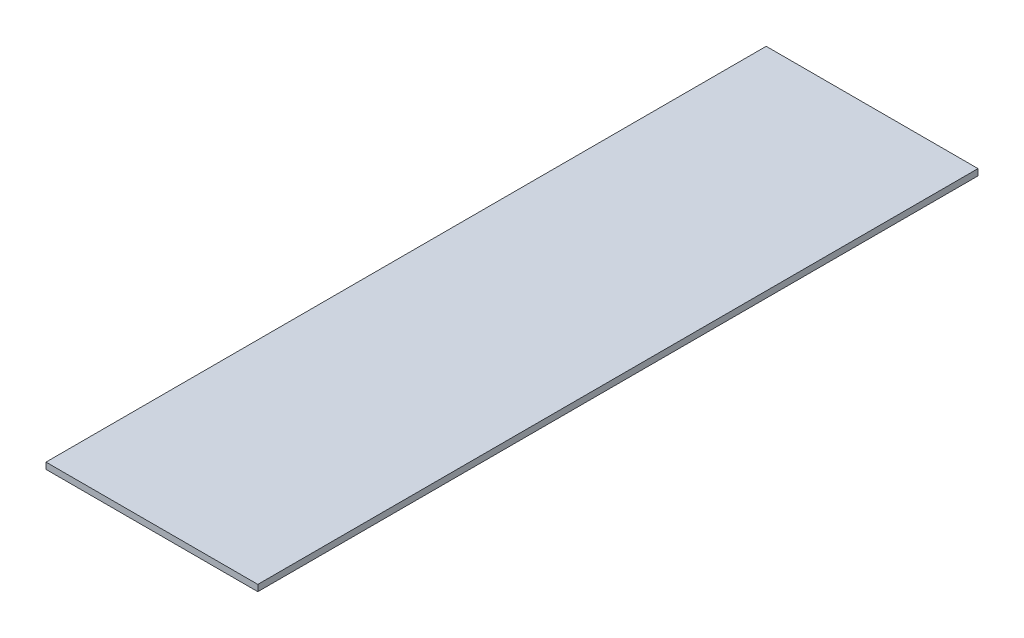
ISO-10303-21;
HEADER;
FILE_DESCRIPTION(('STEP AP214'),'2;1');
FILE_NAME('part.step','',(''),(''),'','','');
FILE_SCHEMA(('AUTOMOTIVE_DESIGN { 1 0 10303 214 1 1 1 1 }'));
ENDSEC;
DATA;
#1=APPLICATION_CONTEXT('core data for automotive mechanical design processes');
#2=APPLICATION_PROTOCOL_DEFINITION('international standard','automotive_design',2000,#1);
#3=PRODUCT_CONTEXT('',#1,'mechanical');
#4=PRODUCT('Part','Part','',(#3));
#5=PRODUCT_RELATED_PRODUCT_CATEGORY('part','',(#4));
#6=PRODUCT_DEFINITION_FORMATION('','',#4);
#7=PRODUCT_DEFINITION_CONTEXT('part definition',#1,'design');
#8=PRODUCT_DEFINITION('design','',#6,#7);
#9=PRODUCT_DEFINITION_SHAPE('','',#8);
#10=(LENGTH_UNIT() NAMED_UNIT(*) SI_UNIT(.MILLI.,.METRE.));
#11=(NAMED_UNIT(*) PLANE_ANGLE_UNIT() SI_UNIT($,.RADIAN.));
#12=(NAMED_UNIT(*) SI_UNIT($,.STERADIAN.) SOLID_ANGLE_UNIT());
#13=UNCERTAINTY_MEASURE_WITH_UNIT(LENGTH_MEASURE(1.E-05),#10,'distance_accuracy_value','');
#14=(GEOMETRIC_REPRESENTATION_CONTEXT(3) GLOBAL_UNCERTAINTY_ASSIGNED_CONTEXT((#13)) GLOBAL_UNIT_ASSIGNED_CONTEXT((#10,
#11,#12)) REPRESENTATION_CONTEXT('',''));
#15=CARTESIAN_POINT('',(0.,0.,0.));
#16=DIRECTION('',(0.,0.,1.));
#17=DIRECTION('',(1.,0.,0.));
#18=AXIS2_PLACEMENT_3D('',#15,#16,#17);
#19=CARTESIAN_POINT('',(0.,1.905,0.));
#20=DIRECTION('',(1.,0.,0.));
#21=DIRECTION('',(0.,0.,-1.));
#22=AXIS2_PLACEMENT_3D('',#19,#20,#21);
#23=PLANE('',#22);
#24=DIRECTION('',(0.,0.,1.));
#25=VECTOR('',#24,1.);
#26=CARTESIAN_POINT('',(0.,0.,0.));
#27=LINE('',#26,#25);
#28=CARTESIAN_POINT('',(0.,0.,-215.9));
#29=VERTEX_POINT('',#28);
#30=CARTESIAN_POINT('',(0.,0.,0.));
#31=VERTEX_POINT('',#30);
#32=EDGE_CURVE('E111',#29,#31,#27,.T.);
#33=ORIENTED_EDGE('',*,*,#32,.T.);
#34=DIRECTION('',(0.,-1.,0.));
#35=VECTOR('',#34,1.);
#36=CARTESIAN_POINT('',(0.,1.905,0.));
#37=LINE('',#36,#35);
#38=CARTESIAN_POINT('',(0.,1.905,0.));
#39=VERTEX_POINT('',#38);
#40=EDGE_CURVE('E11',#39,#31,#37,.T.);
#41=ORIENTED_EDGE('',*,*,#40,.F.);
#42=DIRECTION('',(0.,0.,1.));
#43=VECTOR('',#42,1.);
#44=CARTESIAN_POINT('',(0.,1.905,0.));
#45=LINE('',#44,#43);
#46=CARTESIAN_POINT('',(0.,1.905,-215.9));
#47=VERTEX_POINT('',#46);
#48=EDGE_CURVE('E95',#47,#39,#45,.T.);
#49=ORIENTED_EDGE('',*,*,#48,.F.);
#50=DIRECTION('',(0.,-1.,0.));
#51=VECTOR('',#50,1.);
#52=CARTESIAN_POINT('',(0.,1.905,-215.9));
#53=LINE('',#52,#51);
#54=EDGE_CURVE('E107',#47,#29,#53,.T.);
#55=ORIENTED_EDGE('',*,*,#54,.T.);
#56=EDGE_LOOP('',(#33,#41,#49,#55));
#57=FACE_BOUND('',#56,.T.);
#58=ADVANCED_FACE('F43',(#57),#23,.F.);
#59=CARTESIAN_POINT('',(0.,1.905,0.));
#60=DIRECTION('',(0.,0.,-1.));
#61=DIRECTION('',(-1.,0.,0.));
#62=AXIS2_PLACEMENT_3D('',#59,#60,#61);
#63=PLANE('',#62);
#64=DIRECTION('',(1.,0.,0.));
#65=VECTOR('',#64,1.);
#66=CARTESIAN_POINT('',(0.,0.,0.));
#67=LINE('',#66,#65);
#68=CARTESIAN_POINT('',(63.5,0.,0.));
#69=VERTEX_POINT('',#68);
#70=EDGE_CURVE('E100',#31,#69,#67,.T.);
#71=ORIENTED_EDGE('',*,*,#70,.T.);
#72=DIRECTION('',(0.,-1.,0.));
#73=VECTOR('',#72,1.);
#74=CARTESIAN_POINT('',(63.5,1.905,0.));
#75=LINE('',#74,#73);
#76=CARTESIAN_POINT('',(63.5,1.905,0.));
#77=VERTEX_POINT('',#76);
#78=EDGE_CURVE('E52',#77,#69,#75,.T.);
#79=ORIENTED_EDGE('',*,*,#78,.F.);
#80=DIRECTION('',(1.,0.,0.));
#81=VECTOR('',#80,1.);
#82=CARTESIAN_POINT('',(0.,1.905,0.));
#83=LINE('',#82,#81);
#84=EDGE_CURVE('E90',#39,#77,#83,.T.);
#85=ORIENTED_EDGE('',*,*,#84,.F.);
#86=ORIENTED_EDGE('',*,*,#40,.T.);
#87=EDGE_LOOP('',(#71,#79,#85,#86));
#88=FACE_BOUND('',#87,.T.);
#89=ADVANCED_FACE('F99',(#88),#63,.F.);
#90=CARTESIAN_POINT('',(63.5,1.905,0.));
#91=DIRECTION('',(-1.,0.,0.));
#92=DIRECTION('',(0.,0.,1.));
#93=AXIS2_PLACEMENT_3D('',#90,#91,#92);
#94=PLANE('',#93);
#95=DIRECTION('',(0.,0.,-1.));
#96=VECTOR('',#95,1.);
#97=CARTESIAN_POINT('',(63.5,0.,0.));
#98=LINE('',#97,#96);
#99=CARTESIAN_POINT('',(63.5,0.,-215.9));
#100=VERTEX_POINT('',#99);
#101=EDGE_CURVE('E77',#69,#100,#98,.T.);
#102=ORIENTED_EDGE('',*,*,#101,.T.);
#103=DIRECTION('',(0.,-1.,0.));
#104=VECTOR('',#103,1.);
#105=CARTESIAN_POINT('',(63.5,1.905,-215.9));
#106=LINE('',#105,#104);
#107=CARTESIAN_POINT('',(63.5,1.905,-215.9));
#108=VERTEX_POINT('',#107);
#109=EDGE_CURVE('E102',#108,#100,#106,.T.);
#110=ORIENTED_EDGE('',*,*,#109,.F.);
#111=DIRECTION('',(0.,0.,-1.));
#112=VECTOR('',#111,1.);
#113=CARTESIAN_POINT('',(63.5,1.905,0.));
#114=LINE('',#113,#112);
#115=EDGE_CURVE('E93',#77,#108,#114,.T.);
#116=ORIENTED_EDGE('',*,*,#115,.F.);
#117=ORIENTED_EDGE('',*,*,#78,.T.);
#118=EDGE_LOOP('',(#102,#110,#116,#117));
#119=FACE_BOUND('',#118,.T.);
#120=ADVANCED_FACE('F103',(#119),#94,.F.);
#121=CARTESIAN_POINT('',(0.,1.905,-215.9));
#122=DIRECTION('',(0.,0.,1.));
#123=DIRECTION('',(1.,0.,0.));
#124=AXIS2_PLACEMENT_3D('',#121,#122,#123);
#125=PLANE('',#124);
#126=DIRECTION('',(-1.,0.,0.));
#127=VECTOR('',#126,1.);
#128=CARTESIAN_POINT('',(0.,0.,-215.9));
#129=LINE('',#128,#127);
#130=EDGE_CURVE('E83',#100,#29,#129,.T.);
#131=ORIENTED_EDGE('',*,*,#130,.T.);
#132=ORIENTED_EDGE('',*,*,#54,.F.);
#133=DIRECTION('',(-1.,0.,0.));
#134=VECTOR('',#133,1.);
#135=CARTESIAN_POINT('',(0.,1.905,-215.9));
#136=LINE('',#135,#134);
#137=EDGE_CURVE('E60',#108,#47,#136,.T.);
#138=ORIENTED_EDGE('',*,*,#137,.F.);
#139=ORIENTED_EDGE('',*,*,#109,.T.);
#140=EDGE_LOOP('',(#131,#132,#138,#139));
#141=FACE_BOUND('',#140,.T.);
#142=ADVANCED_FACE('F124',(#141),#125,.F.);
#143=CARTESIAN_POINT('',(0.,1.905,0.));
#144=DIRECTION('',(0.,-1.,0.));
#145=DIRECTION('',(0.,0.,-1.));
#146=AXIS2_PLACEMENT_3D('',#143,#144,#145);
#147=PLANE('',#146);
#148=ORIENTED_EDGE('',*,*,#48,.T.);
#149=ORIENTED_EDGE('',*,*,#84,.T.);
#150=ORIENTED_EDGE('',*,*,#115,.T.);
#151=ORIENTED_EDGE('',*,*,#137,.T.);
#152=EDGE_LOOP('',(#148,#149,#150,#151));
#153=FACE_BOUND('',#152,.T.);
#154=ADVANCED_FACE('F91',(#153),#147,.F.);
#155=CARTESIAN_POINT('',(0.,0.,0.));
#156=DIRECTION('',(0.,-1.,0.));
#157=DIRECTION('',(0.,0.,-1.));
#158=AXIS2_PLACEMENT_3D('',#155,#156,#157);
#159=PLANE('',#158);
#160=ORIENTED_EDGE('',*,*,#32,.F.);
#161=ORIENTED_EDGE('',*,*,#130,.F.);
#162=ORIENTED_EDGE('',*,*,#101,.F.);
#163=ORIENTED_EDGE('',*,*,#70,.F.);
#164=EDGE_LOOP('',(#160,#161,#162,#163));
#165=FACE_BOUND('',#164,.T.);
#166=ADVANCED_FACE('F127',(#165),#159,.T.);
#167=CLOSED_SHELL('',(#58,#89,#120,#142,#154,#166));
#168=MANIFOLD_SOLID_BREP('B2',#167);
#169=ADVANCED_BREP_SHAPE_REPRESENTATION('',(#18,#168),#14);
#170=SHAPE_DEFINITION_REPRESENTATION(#9,#169);
ENDSEC;
END-ISO-10303-21;
